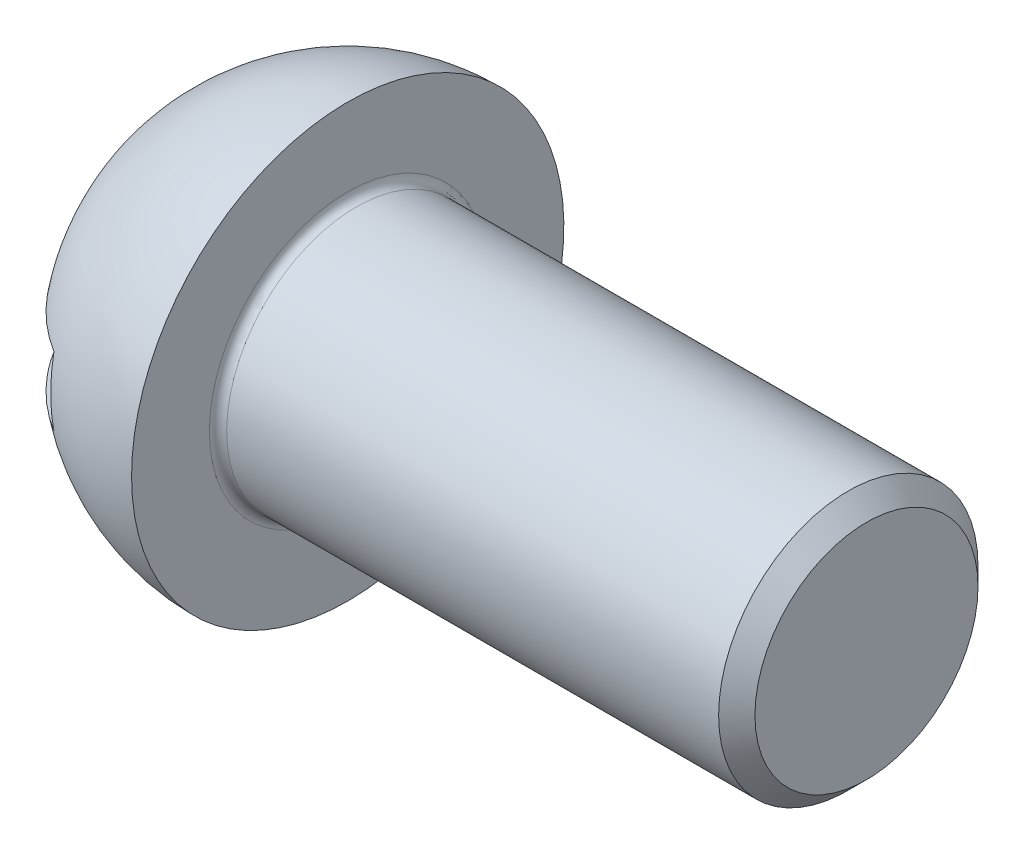
ISO-10303-21;
HEADER;
FILE_DESCRIPTION(('STEP AP214'),'2;1');
FILE_NAME('part.step','',(''),(''),'','','');
FILE_SCHEMA(('AUTOMOTIVE_DESIGN { 1 0 10303 214 1 1 1 1 }'));
ENDSEC;
DATA;
#1=APPLICATION_CONTEXT('core data for automotive mechanical design processes');
#2=APPLICATION_PROTOCOL_DEFINITION('international standard','automotive_design',2000,#1);
#3=PRODUCT_CONTEXT('',#1,'mechanical');
#4=PRODUCT('Part','Part','',(#3));
#5=PRODUCT_RELATED_PRODUCT_CATEGORY('part','',(#4));
#6=PRODUCT_DEFINITION_FORMATION('','',#4);
#7=PRODUCT_DEFINITION_CONTEXT('part definition',#1,'design');
#8=PRODUCT_DEFINITION('design','',#6,#7);
#9=PRODUCT_DEFINITION_SHAPE('','',#8);
#10=(LENGTH_UNIT() NAMED_UNIT(*) SI_UNIT(.MILLI.,.METRE.));
#11=(NAMED_UNIT(*) PLANE_ANGLE_UNIT() SI_UNIT($,.RADIAN.));
#12=(NAMED_UNIT(*) SI_UNIT($,.STERADIAN.) SOLID_ANGLE_UNIT());
#13=UNCERTAINTY_MEASURE_WITH_UNIT(LENGTH_MEASURE(1.E-05),#10,'distance_accuracy_value','');
#14=(GEOMETRIC_REPRESENTATION_CONTEXT(3) GLOBAL_UNCERTAINTY_ASSIGNED_CONTEXT((#13)) GLOBAL_UNIT_ASSIGNED_CONTEXT((#10,
#11,#12)) REPRESENTATION_CONTEXT('',''));
#15=CARTESIAN_POINT('',(0.,0.,0.));
#16=DIRECTION('',(0.,0.,1.));
#17=DIRECTION('',(1.,0.,0.));
#18=AXIS2_PLACEMENT_3D('',#15,#16,#17);
#19=CARTESIAN_POINT('',(2.5,0.,0.));
#20=DIRECTION('',(-1.,0.,0.));
#21=DIRECTION('',(0.,0.,-1.));
#22=AXIS2_PLACEMENT_3D('',#19,#20,#21);
#23=SPHERICAL_SURFACE('',#22,2.5);
#24=CARTESIAN_POINT('',(2.5,0.,0.));
#25=DIRECTION('',(-1.,0.,0.));
#26=DIRECTION('',(0.,0.,1.));
#27=AXIS2_PLACEMENT_3D('',#24,#25,#26);
#28=CIRCLE('',#27,2.5);
#29=CARTESIAN_POINT('',(2.5,0.,2.5));
#30=VERTEX_POINT('',#29);
#31=EDGE_CURVE('E78',#30,#30,#28,.T.);
#32=ORIENTED_EDGE('',*,*,#31,.T.);
#33=EDGE_LOOP('',(#32));
#34=FACE_BOUND('',#33,.T.);
#35=CARTESIAN_POINT('',(1.2,0.,0.));
#36=DIRECTION('',(-1.,0.,0.));
#37=DIRECTION('',(0.,0.,1.));
#38=AXIS2_PLACEMENT_3D('',#35,#36,#37);
#39=CIRCLE('',#38,2.13541565040626);
#40=CARTESIAN_POINT('',(1.2,0.4,-2.0976176963403));
#41=VERTEX_POINT('',#40);
#42=CARTESIAN_POINT('',(1.2,-0.4,-2.0976176963403));
#43=VERTEX_POINT('',#42);
#44=EDGE_CURVE('E11',#41,#43,#39,.T.);
#45=ORIENTED_EDGE('',*,*,#44,.F.);
#46=CARTESIAN_POINT('',(2.5,0.4,0.));
#47=DIRECTION('',(0.,-1.,0.));
#48=DIRECTION('',(0.,0.,-1.));
#49=AXIS2_PLACEMENT_3D('',#46,#47,#48);
#50=CIRCLE('',#49,2.46779253585061);
#51=CARTESIAN_POINT('',(1.2,0.4,2.0976176963403));
#52=VERTEX_POINT('',#51);
#53=EDGE_CURVE('E32',#52,#41,#50,.T.);
#54=ORIENTED_EDGE('',*,*,#53,.F.);
#55=CARTESIAN_POINT('',(1.2,-0.4,2.0976176963403));
#56=VERTEX_POINT('',#55);
#57=EDGE_CURVE('E38',#56,#52,#39,.T.);
#58=ORIENTED_EDGE('',*,*,#57,.F.);
#59=CARTESIAN_POINT('',(2.5,-0.4,0.));
#60=DIRECTION('',(0.,1.,0.));
#61=DIRECTION('',(0.,0.,1.));
#62=AXIS2_PLACEMENT_3D('',#59,#60,#61);
#63=CIRCLE('',#62,2.46779253585061);
#64=EDGE_CURVE('E60',#43,#56,#63,.T.);
#65=ORIENTED_EDGE('',*,*,#64,.F.);
#66=EDGE_LOOP('',(#45,#54,#58,#65));
#67=FACE_BOUND('',#66,.T.);
#68=ADVANCED_FACE('F29',(#34,#67),#23,.T.);
#69=CARTESIAN_POINT('',(2.5,0.,-2.5));
#70=DIRECTION('',(-1.,0.,0.));
#71=DIRECTION('',(0.,0.,1.));
#72=AXIS2_PLACEMENT_3D('',#69,#70,#71);
#73=PLANE('',#72);
#74=CARTESIAN_POINT('',(2.5,0.,0.));
#75=DIRECTION('',(-1.,0.,0.));
#76=DIRECTION('',(0.,0.,1.));
#77=AXIS2_PLACEMENT_3D('',#74,#75,#76);
#78=CIRCLE('',#77,1.6);
#79=CARTESIAN_POINT('',(2.5,0.,1.6));
#80=VERTEX_POINT('',#79);
#81=EDGE_CURVE('E69',#80,#80,#78,.T.);
#82=ORIENTED_EDGE('',*,*,#81,.T.);
#83=EDGE_LOOP('',(#82));
#84=FACE_BOUND('',#83,.T.);
#85=ORIENTED_EDGE('',*,*,#31,.F.);
#86=EDGE_LOOP('',(#85));
#87=FACE_BOUND('',#86,.T.);
#88=ADVANCED_FACE('F92',(#84,#87),#73,.F.);
#89=CARTESIAN_POINT('',(0.,0.,0.));
#90=DIRECTION('',(-1.,0.,0.));
#91=DIRECTION('',(0.,0.,1.));
#92=AXIS2_PLACEMENT_3D('',#89,#90,#91);
#93=CYLINDRICAL_SURFACE('',#92,1.5);
#94=CARTESIAN_POINT('',(2.6,0.,0.));
#95=DIRECTION('',(-1.,0.,0.));
#96=DIRECTION('',(0.,0.,1.));
#97=AXIS2_PLACEMENT_3D('',#94,#95,#96);
#98=CIRCLE('',#97,1.5);
#99=CARTESIAN_POINT('',(2.6,0.,1.5));
#100=VERTEX_POINT('',#99);
#101=EDGE_CURVE('E65',#100,#100,#98,.F.);
#102=ORIENTED_EDGE('',*,*,#101,.T.);
#103=EDGE_LOOP('',(#102));
#104=FACE_BOUND('',#103,.T.);
#105=CARTESIAN_POINT('',(8.29,0.,0.));
#106=DIRECTION('',(-1.,0.,0.));
#107=DIRECTION('',(0.,0.,1.));
#108=AXIS2_PLACEMENT_3D('',#105,#106,#107);
#109=CIRCLE('',#108,1.5);
#110=CARTESIAN_POINT('',(8.29,0.,1.5));
#111=VERTEX_POINT('',#110);
#112=EDGE_CURVE('E75',#111,#111,#109,.T.);
#113=ORIENTED_EDGE('',*,*,#112,.T.);
#114=EDGE_LOOP('',(#113));
#115=FACE_BOUND('',#114,.T.);
#116=ADVANCED_FACE('F98',(#104,#115),#93,.T.);
#117=CARTESIAN_POINT('',(8.5,0.,-1.5));
#118=DIRECTION('',(-1.,0.,0.));
#119=DIRECTION('',(0.,0.,1.));
#120=AXIS2_PLACEMENT_3D('',#117,#118,#119);
#121=PLANE('',#120);
#122=CARTESIAN_POINT('',(8.5,0.,0.));
#123=DIRECTION('',(-1.,0.,0.));
#124=DIRECTION('',(0.,0.,1.));
#125=AXIS2_PLACEMENT_3D('',#122,#123,#124);
#126=CIRCLE('',#125,1.29);
#127=CARTESIAN_POINT('',(8.5,0.,1.29));
#128=VERTEX_POINT('',#127);
#129=EDGE_CURVE('E72',#128,#128,#126,.F.);
#130=ORIENTED_EDGE('',*,*,#129,.T.);
#131=EDGE_LOOP('',(#130));
#132=FACE_BOUND('',#131,.T.);
#133=ADVANCED_FACE('F106',(#132),#121,.F.);
#134=CARTESIAN_POINT('',(8.29,0.,0.));
#135=DIRECTION('',(-1.,0.,0.));
#136=DIRECTION('',(0.,0.,1.));
#137=AXIS2_PLACEMENT_3D('',#134,#135,#136);
#138=CONICAL_SURFACE('',#137,1.5,0.785398163397451);
#139=ORIENTED_EDGE('',*,*,#129,.F.);
#140=EDGE_LOOP('',(#139));
#141=FACE_BOUND('',#140,.T.);
#142=ORIENTED_EDGE('',*,*,#112,.F.);
#143=EDGE_LOOP('',(#142));
#144=FACE_BOUND('',#143,.T.);
#145=ADVANCED_FACE('F112',(#141,#144),#138,.T.);
#146=CARTESIAN_POINT('',(2.6,0.,0.));
#147=DIRECTION('',(-1.,0.,0.));
#148=DIRECTION('',(0.,0.,1.));
#149=AXIS2_PLACEMENT_3D('',#146,#147,#148);
#150=TOROIDAL_SURFACE('',#149,1.6,0.1);
#151=ORIENTED_EDGE('',*,*,#101,.F.);
#152=EDGE_LOOP('',(#151));
#153=FACE_BOUND('',#152,.T.);
#154=ORIENTED_EDGE('',*,*,#81,.F.);
#155=EDGE_LOOP('',(#154));
#156=FACE_BOUND('',#155,.T.);
#157=ADVANCED_FACE('F89',(#153,#156),#150,.F.);
#158=CARTESIAN_POINT('',(1.2,0.4,-2.5));
#159=DIRECTION('',(0.,-1.,0.));
#160=DIRECTION('',(0.,0.,-1.));
#161=AXIS2_PLACEMENT_3D('',#158,#159,#160);
#162=PLANE('',#161);
#163=ORIENTED_EDGE('',*,*,#53,.T.);
#164=DIRECTION('',(0.,0.,1.));
#165=VECTOR('',#164,1.);
#166=CARTESIAN_POINT('',(1.2,0.4,-2.5));
#167=LINE('',#166,#165);
#168=EDGE_CURVE('E57',#41,#52,#167,.T.);
#169=ORIENTED_EDGE('',*,*,#168,.T.);
#170=EDGE_LOOP('',(#163,#169));
#171=FACE_BOUND('',#170,.T.);
#172=ADVANCED_FACE('F56',(#171),#162,.T.);
#173=CARTESIAN_POINT('',(1.2,-0.4,-2.5));
#174=DIRECTION('',(0.,1.,0.));
#175=DIRECTION('',(0.,0.,1.));
#176=AXIS2_PLACEMENT_3D('',#173,#174,#175);
#177=PLANE('',#176);
#178=ORIENTED_EDGE('',*,*,#64,.T.);
#179=DIRECTION('',(0.,0.,-1.));
#180=VECTOR('',#179,1.);
#181=CARTESIAN_POINT('',(1.2,-0.4,-2.5));
#182=LINE('',#181,#180);
#183=EDGE_CURVE('E44',#56,#43,#182,.T.);
#184=ORIENTED_EDGE('',*,*,#183,.T.);
#185=EDGE_LOOP('',(#178,#184));
#186=FACE_BOUND('',#185,.T.);
#187=ADVANCED_FACE('F81',(#186),#177,.T.);
#188=CARTESIAN_POINT('',(1.2,0.4,-2.5));
#189=DIRECTION('',(-1.,0.,0.));
#190=DIRECTION('',(0.,0.,1.));
#191=AXIS2_PLACEMENT_3D('',#188,#189,#190);
#192=PLANE('',#191);
#193=ORIENTED_EDGE('',*,*,#44,.T.);
#194=ORIENTED_EDGE('',*,*,#183,.F.);
#195=ORIENTED_EDGE('',*,*,#57,.T.);
#196=ORIENTED_EDGE('',*,*,#168,.F.);
#197=EDGE_LOOP('',(#193,#194,#195,#196));
#198=FACE_BOUND('',#197,.T.);
#199=ADVANCED_FACE('F61',(#198),#192,.T.);
#200=CLOSED_SHELL('',(#68,#88,#116,#133,#145,#157,#172,#187,#199));
#201=MANIFOLD_SOLID_BREP('B2',#200);
#202=ADVANCED_BREP_SHAPE_REPRESENTATION('',(#18,#201),#14);
#203=SHAPE_DEFINITION_REPRESENTATION(#9,#202);
ENDSEC;
END-ISO-10303-21;
